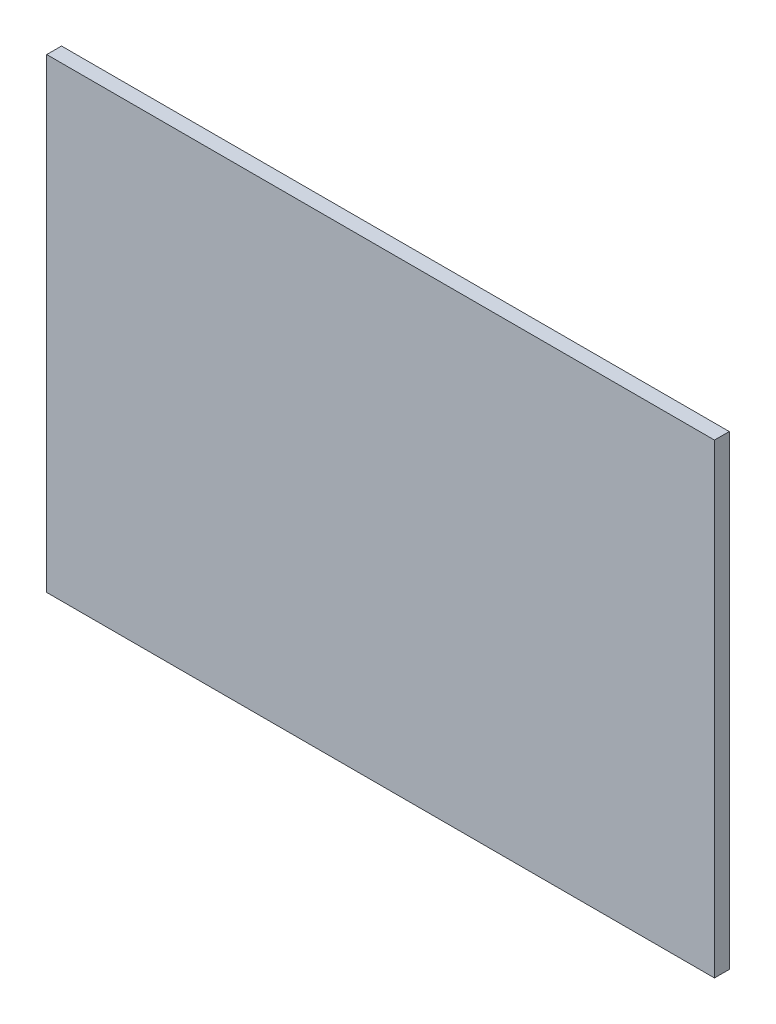
ISO-10303-21;
HEADER;
FILE_DESCRIPTION(('STEP AP214'),'2;1');
FILE_NAME('part.step','',(''),(''),'','','');
FILE_SCHEMA(('AUTOMOTIVE_DESIGN { 1 0 10303 214 1 1 1 1 }'));
ENDSEC;
DATA;
#1=APPLICATION_CONTEXT('core data for automotive mechanical design processes');
#2=APPLICATION_PROTOCOL_DEFINITION('international standard','automotive_design',2000,#1);
#3=PRODUCT_CONTEXT('',#1,'mechanical');
#4=PRODUCT('Part','Part','',(#3));
#5=PRODUCT_RELATED_PRODUCT_CATEGORY('part','',(#4));
#6=PRODUCT_DEFINITION_FORMATION('','',#4);
#7=PRODUCT_DEFINITION_CONTEXT('part definition',#1,'design');
#8=PRODUCT_DEFINITION('design','',#6,#7);
#9=PRODUCT_DEFINITION_SHAPE('','',#8);
#10=(LENGTH_UNIT() NAMED_UNIT(*) SI_UNIT(.MILLI.,.METRE.));
#11=(NAMED_UNIT(*) PLANE_ANGLE_UNIT() SI_UNIT($,.RADIAN.));
#12=(NAMED_UNIT(*) SI_UNIT($,.STERADIAN.) SOLID_ANGLE_UNIT());
#13=UNCERTAINTY_MEASURE_WITH_UNIT(LENGTH_MEASURE(1.E-05),#10,'distance_accuracy_value','');
#14=(GEOMETRIC_REPRESENTATION_CONTEXT(3) GLOBAL_UNCERTAINTY_ASSIGNED_CONTEXT((#13)) GLOBAL_UNIT_ASSIGNED_CONTEXT((#10,
#11,#12)) REPRESENTATION_CONTEXT('',''));
#15=CARTESIAN_POINT('',(0.,0.,0.));
#16=DIRECTION('',(0.,0.,1.));
#17=DIRECTION('',(1.,0.,0.));
#18=AXIS2_PLACEMENT_3D('',#15,#16,#17);
#19=CARTESIAN_POINT('',(430.,-300.,19.05));
#20=DIRECTION('',(-1.,0.,0.));
#21=DIRECTION('',(0.,0.,1.));
#22=AXIS2_PLACEMENT_3D('',#19,#20,#21);
#23=PLANE('',#22);
#24=DIRECTION('',(0.,1.,0.));
#25=VECTOR('',#24,1.);
#26=CARTESIAN_POINT('',(430.,-300.,0.));
#27=LINE('',#26,#25);
#28=CARTESIAN_POINT('',(430.,-300.,0.));
#29=VERTEX_POINT('',#28);
#30=CARTESIAN_POINT('',(430.,300.,0.));
#31=VERTEX_POINT('',#30);
#32=EDGE_CURVE('E95',#29,#31,#27,.T.);
#33=ORIENTED_EDGE('',*,*,#32,.T.);
#34=DIRECTION('',(0.,0.,-1.));
#35=VECTOR('',#34,1.);
#36=CARTESIAN_POINT('',(430.,300.,19.05));
#37=LINE('',#36,#35);
#38=CARTESIAN_POINT('',(430.,300.,19.05));
#39=VERTEX_POINT('',#38);
#40=EDGE_CURVE('E11',#39,#31,#37,.T.);
#41=ORIENTED_EDGE('',*,*,#40,.F.);
#42=DIRECTION('',(0.,1.,0.));
#43=VECTOR('',#42,1.);
#44=CARTESIAN_POINT('',(430.,-300.,19.05));
#45=LINE('',#44,#43);
#46=CARTESIAN_POINT('',(430.,-300.,19.05));
#47=VERTEX_POINT('',#46);
#48=EDGE_CURVE('E83',#47,#39,#45,.T.);
#49=ORIENTED_EDGE('',*,*,#48,.F.);
#50=DIRECTION('',(0.,0.,-1.));
#51=VECTOR('',#50,1.);
#52=CARTESIAN_POINT('',(430.,-300.,19.05));
#53=LINE('',#52,#51);
#54=EDGE_CURVE('E91',#47,#29,#53,.T.);
#55=ORIENTED_EDGE('',*,*,#54,.T.);
#56=EDGE_LOOP('',(#33,#41,#49,#55));
#57=FACE_BOUND('',#56,.T.);
#58=ADVANCED_FACE('F32',(#57),#23,.F.);
#59=CARTESIAN_POINT('',(-430.,300.,19.05));
#60=DIRECTION('',(0.,-1.,0.));
#61=DIRECTION('',(0.,0.,-1.));
#62=AXIS2_PLACEMENT_3D('',#59,#60,#61);
#63=PLANE('',#62);
#64=DIRECTION('',(-1.,0.,0.));
#65=VECTOR('',#64,1.);
#66=CARTESIAN_POINT('',(-430.,300.,0.));
#67=LINE('',#66,#65);
#68=CARTESIAN_POINT('',(-430.,300.,0.));
#69=VERTEX_POINT('',#68);
#70=EDGE_CURVE('E87',#31,#69,#67,.T.);
#71=ORIENTED_EDGE('',*,*,#70,.T.);
#72=DIRECTION('',(0.,0.,-1.));
#73=VECTOR('',#72,1.);
#74=CARTESIAN_POINT('',(-430.,300.,19.05));
#75=LINE('',#74,#73);
#76=CARTESIAN_POINT('',(-430.,300.,19.05));
#77=VERTEX_POINT('',#76);
#78=EDGE_CURVE('E40',#77,#69,#75,.T.);
#79=ORIENTED_EDGE('',*,*,#78,.F.);
#80=DIRECTION('',(-1.,0.,0.));
#81=VECTOR('',#80,1.);
#82=CARTESIAN_POINT('',(-430.,300.,19.05));
#83=LINE('',#82,#81);
#84=EDGE_CURVE('E78',#39,#77,#83,.T.);
#85=ORIENTED_EDGE('',*,*,#84,.F.);
#86=ORIENTED_EDGE('',*,*,#40,.T.);
#87=EDGE_LOOP('',(#71,#79,#85,#86));
#88=FACE_BOUND('',#87,.T.);
#89=ADVANCED_FACE('F86',(#88),#63,.F.);
#90=CARTESIAN_POINT('',(-430.,-300.,19.05));
#91=DIRECTION('',(1.,0.,0.));
#92=DIRECTION('',(0.,0.,-1.));
#93=AXIS2_PLACEMENT_3D('',#90,#91,#92);
#94=PLANE('',#93);
#95=DIRECTION('',(0.,-1.,0.));
#96=VECTOR('',#95,1.);
#97=CARTESIAN_POINT('',(-430.,-300.,0.));
#98=LINE('',#97,#96);
#99=CARTESIAN_POINT('',(-430.,-300.,0.));
#100=VERTEX_POINT('',#99);
#101=EDGE_CURVE('E65',#69,#100,#98,.T.);
#102=ORIENTED_EDGE('',*,*,#101,.T.);
#103=DIRECTION('',(0.,0.,-1.));
#104=VECTOR('',#103,1.);
#105=CARTESIAN_POINT('',(-430.,-300.,19.05));
#106=LINE('',#105,#104);
#107=CARTESIAN_POINT('',(-430.,-300.,19.05));
#108=VERTEX_POINT('',#107);
#109=EDGE_CURVE('E88',#108,#100,#106,.T.);
#110=ORIENTED_EDGE('',*,*,#109,.F.);
#111=DIRECTION('',(0.,-1.,0.));
#112=VECTOR('',#111,1.);
#113=CARTESIAN_POINT('',(-430.,-300.,19.05));
#114=LINE('',#113,#112);
#115=EDGE_CURVE('E81',#77,#108,#114,.T.);
#116=ORIENTED_EDGE('',*,*,#115,.F.);
#117=ORIENTED_EDGE('',*,*,#78,.T.);
#118=EDGE_LOOP('',(#102,#110,#116,#117));
#119=FACE_BOUND('',#118,.T.);
#120=ADVANCED_FACE('F89',(#119),#94,.F.);
#121=CARTESIAN_POINT('',(-430.,-300.,19.05));
#122=DIRECTION('',(0.,1.,0.));
#123=DIRECTION('',(0.,0.,1.));
#124=AXIS2_PLACEMENT_3D('',#121,#122,#123);
#125=PLANE('',#124);
#126=DIRECTION('',(1.,0.,0.));
#127=VECTOR('',#126,1.);
#128=CARTESIAN_POINT('',(-430.,-300.,0.));
#129=LINE('',#128,#127);
#130=EDGE_CURVE('E71',#100,#29,#129,.T.);
#131=ORIENTED_EDGE('',*,*,#130,.T.);
#132=ORIENTED_EDGE('',*,*,#54,.F.);
#133=DIRECTION('',(1.,0.,0.));
#134=VECTOR('',#133,1.);
#135=CARTESIAN_POINT('',(-430.,-300.,19.05));
#136=LINE('',#135,#134);
#137=EDGE_CURVE('E48',#108,#47,#136,.T.);
#138=ORIENTED_EDGE('',*,*,#137,.F.);
#139=ORIENTED_EDGE('',*,*,#109,.T.);
#140=EDGE_LOOP('',(#131,#132,#138,#139));
#141=FACE_BOUND('',#140,.T.);
#142=ADVANCED_FACE('F102',(#141),#125,.F.);
#143=CARTESIAN_POINT('',(0.,0.,19.05));
#144=DIRECTION('',(0.,0.,-1.));
#145=DIRECTION('',(-1.,0.,0.));
#146=AXIS2_PLACEMENT_3D('',#143,#144,#145);
#147=PLANE('',#146);
#148=ORIENTED_EDGE('',*,*,#48,.T.);
#149=ORIENTED_EDGE('',*,*,#84,.T.);
#150=ORIENTED_EDGE('',*,*,#115,.T.);
#151=ORIENTED_EDGE('',*,*,#137,.T.);
#152=EDGE_LOOP('',(#148,#149,#150,#151));
#153=FACE_BOUND('',#152,.T.);
#154=ADVANCED_FACE('F79',(#153),#147,.F.);
#155=CARTESIAN_POINT('',(0.,0.,0.));
#156=DIRECTION('',(0.,0.,-1.));
#157=DIRECTION('',(-1.,0.,0.));
#158=AXIS2_PLACEMENT_3D('',#155,#156,#157);
#159=PLANE('',#158);
#160=ORIENTED_EDGE('',*,*,#32,.F.);
#161=ORIENTED_EDGE('',*,*,#130,.F.);
#162=ORIENTED_EDGE('',*,*,#101,.F.);
#163=ORIENTED_EDGE('',*,*,#70,.F.);
#164=EDGE_LOOP('',(#160,#161,#162,#163));
#165=FACE_BOUND('',#164,.T.);
#166=ADVANCED_FACE('F105',(#165),#159,.T.);
#167=CLOSED_SHELL('',(#58,#89,#120,#142,#154,#166));
#168=MANIFOLD_SOLID_BREP('B2',#167);
#169=ADVANCED_BREP_SHAPE_REPRESENTATION('',(#18,#168),#14);
#170=SHAPE_DEFINITION_REPRESENTATION(#9,#169);
ENDSEC;
END-ISO-10303-21;
